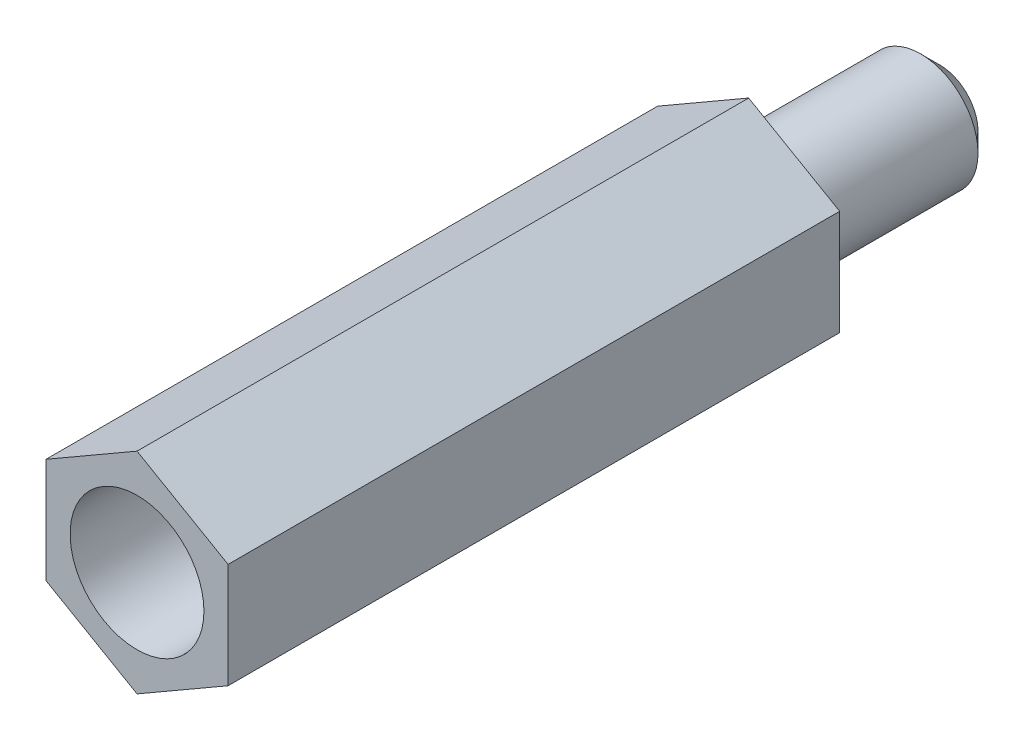
ISO-10303-21;
HEADER;
FILE_DESCRIPTION(('STEP AP214'),'2;1');
FILE_NAME('part.step','',(''),(''),'','','');
FILE_SCHEMA(('AUTOMOTIVE_DESIGN { 1 0 10303 214 1 1 1 1 }'));
ENDSEC;
DATA;
#1=APPLICATION_CONTEXT('core data for automotive mechanical design processes');
#2=APPLICATION_PROTOCOL_DEFINITION('international standard','automotive_design',2000,#1);
#3=PRODUCT_CONTEXT('',#1,'mechanical');
#4=PRODUCT('Part','Part','',(#3));
#5=PRODUCT_RELATED_PRODUCT_CATEGORY('part','',(#4));
#6=PRODUCT_DEFINITION_FORMATION('','',#4);
#7=PRODUCT_DEFINITION_CONTEXT('part definition',#1,'design');
#8=PRODUCT_DEFINITION('design','',#6,#7);
#9=PRODUCT_DEFINITION_SHAPE('','',#8);
#10=(LENGTH_UNIT() NAMED_UNIT(*) SI_UNIT(.MILLI.,.METRE.));
#11=(NAMED_UNIT(*) PLANE_ANGLE_UNIT() SI_UNIT($,.RADIAN.));
#12=(NAMED_UNIT(*) SI_UNIT($,.STERADIAN.) SOLID_ANGLE_UNIT());
#13=UNCERTAINTY_MEASURE_WITH_UNIT(LENGTH_MEASURE(1.E-05),#10,'distance_accuracy_value','');
#14=(GEOMETRIC_REPRESENTATION_CONTEXT(3) GLOBAL_UNCERTAINTY_ASSIGNED_CONTEXT((#13)) GLOBAL_UNIT_ASSIGNED_CONTEXT((#10,
#11,#12)) REPRESENTATION_CONTEXT('',''));
#15=CARTESIAN_POINT('',(0.,0.,0.));
#16=DIRECTION('',(0.,0.,1.));
#17=DIRECTION('',(1.,0.,0.));
#18=AXIS2_PLACEMENT_3D('',#15,#16,#17);
#19=CARTESIAN_POINT('',(0.,2.75,0.));
#20=DIRECTION('',(0.,0.,1.));
#21=DIRECTION('',(1.,0.,0.));
#22=AXIS2_PLACEMENT_3D('',#19,#20,#21);
#23=PLANE('',#22);
#24=DIRECTION('',(-0.866025403784442,0.499999999999995,0.));
#25=VECTOR('',#24,1.);
#26=CARTESIAN_POINT('',(2.38156986040719,1.37500000000003,0.));
#27=LINE('',#26,#25);
#28=CARTESIAN_POINT('',(2.38156986040719,1.37500000000003,0.));
#29=VERTEX_POINT('',#28);
#30=CARTESIAN_POINT('',(0.,2.75,0.));
#31=VERTEX_POINT('',#30);
#32=EDGE_CURVE('E116',#29,#31,#27,.T.);
#33=ORIENTED_EDGE('',*,*,#32,.F.);
#34=DIRECTION('',(0.,1.,0.));
#35=VECTOR('',#34,1.);
#36=CARTESIAN_POINT('',(2.38156986040722,-1.37499999999998,0.));
#37=LINE('',#36,#35);
#38=CARTESIAN_POINT('',(2.38156986040722,-1.37499999999998,0.));
#39=VERTEX_POINT('',#38);
#40=EDGE_CURVE('E76',#39,#29,#37,.T.);
#41=ORIENTED_EDGE('',*,*,#40,.F.);
#42=DIRECTION('',(0.866025403784434,0.500000000000007,0.));
#43=VECTOR('',#42,1.);
#44=CARTESIAN_POINT('',(0.,-2.75,0.));
#45=LINE('',#44,#43);
#46=CARTESIAN_POINT('',(0.,-2.75,0.));
#47=VERTEX_POINT('',#46);
#48=EDGE_CURVE('E70',#47,#39,#45,.T.);
#49=ORIENTED_EDGE('',*,*,#48,.F.);
#50=DIRECTION('',(0.866025403784441,-0.499999999999995,0.));
#51=VECTOR('',#50,1.);
#52=CARTESIAN_POINT('',(-2.3815698604072,-1.37500000000001,0.));
#53=LINE('',#52,#51);
#54=CARTESIAN_POINT('',(-2.3815698604072,-1.37500000000001,0.));
#55=VERTEX_POINT('',#54);
#56=EDGE_CURVE('E106',#55,#47,#53,.T.);
#57=ORIENTED_EDGE('',*,*,#56,.F.);
#58=DIRECTION('',(0.,-1.,0.));
#59=VECTOR('',#58,1.);
#60=CARTESIAN_POINT('',(-2.38156986040721,1.37499999999999,0.));
#61=LINE('',#60,#59);
#62=CARTESIAN_POINT('',(-2.38156986040721,1.37499999999999,0.));
#63=VERTEX_POINT('',#62);
#64=EDGE_CURVE('E122',#63,#55,#61,.T.);
#65=ORIENTED_EDGE('',*,*,#64,.F.);
#66=DIRECTION('',(-0.866025403784438,-0.500000000000001,0.));
#67=VECTOR('',#66,1.);
#68=CARTESIAN_POINT('',(0.,2.75,0.));
#69=LINE('',#68,#67);
#70=EDGE_CURVE('E119',#31,#63,#69,.T.);
#71=ORIENTED_EDGE('',*,*,#70,.F.);
#72=EDGE_LOOP('',(#33,#41,#49,#57,#65,#71));
#73=FACE_BOUND('',#72,.T.);
#74=CARTESIAN_POINT('',(0.,0.,0.));
#75=DIRECTION('',(0.,0.,1.));
#76=DIRECTION('',(1.,0.,0.));
#77=AXIS2_PLACEMENT_3D('',#74,#75,#76);
#78=CIRCLE('',#77,1.5);
#79=CARTESIAN_POINT('',(1.5,0.,0.));
#80=VERTEX_POINT('',#79);
#81=EDGE_CURVE('E136',#80,#80,#78,.F.);
#82=ORIENTED_EDGE('',*,*,#81,.F.);
#83=EDGE_LOOP('',(#82));
#84=FACE_BOUND('',#83,.T.);
#85=ADVANCED_FACE('F30',(#73,#84),#23,.F.);
#86=CARTESIAN_POINT('',(2.38156986040719,1.37500000000003,16.));
#87=DIRECTION('',(-0.499999999999995,-0.866025403784442,0.));
#88=DIRECTION('',(0.866025403784442,-0.499999999999995,0.));
#89=AXIS2_PLACEMENT_3D('',#86,#87,#88);
#90=PLANE('',#89);
#91=ORIENTED_EDGE('',*,*,#32,.T.);
#92=DIRECTION('',(0.,0.,-1.));
#93=VECTOR('',#92,1.);
#94=CARTESIAN_POINT('',(0.,2.75,16.));
#95=LINE('',#94,#93);
#96=CARTESIAN_POINT('',(0.,2.75,16.));
#97=VERTEX_POINT('',#96);
#98=EDGE_CURVE('E134',#97,#31,#95,.T.);
#99=ORIENTED_EDGE('',*,*,#98,.F.);
#100=DIRECTION('',(-0.866025403784442,0.499999999999995,0.));
#101=VECTOR('',#100,1.);
#102=CARTESIAN_POINT('',(2.38156986040719,1.37500000000003,16.));
#103=LINE('',#102,#101);
#104=CARTESIAN_POINT('',(2.38156986040719,1.37500000000003,16.));
#105=VERTEX_POINT('',#104);
#106=EDGE_CURVE('E127',#105,#97,#103,.T.);
#107=ORIENTED_EDGE('',*,*,#106,.F.);
#108=DIRECTION('',(0.,0.,-1.));
#109=VECTOR('',#108,1.);
#110=CARTESIAN_POINT('',(2.38156986040719,1.37500000000003,16.));
#111=LINE('',#110,#109);
#112=EDGE_CURVE('E112',#105,#29,#111,.T.);
#113=ORIENTED_EDGE('',*,*,#112,.T.);
#114=EDGE_LOOP('',(#91,#99,#107,#113));
#115=FACE_BOUND('',#114,.T.);
#116=ADVANCED_FACE('F153',(#115),#90,.F.);
#117=CARTESIAN_POINT('',(0.,2.75,16.));
#118=DIRECTION('',(0.500000000000001,-0.866025403784438,0.));
#119=DIRECTION('',(0.866025403784438,0.500000000000001,0.));
#120=AXIS2_PLACEMENT_3D('',#117,#118,#119);
#121=PLANE('',#120);
#122=ORIENTED_EDGE('',*,*,#70,.T.);
#123=DIRECTION('',(0.,0.,-1.));
#124=VECTOR('',#123,1.);
#125=CARTESIAN_POINT('',(-2.38156986040721,1.37499999999999,16.));
#126=LINE('',#125,#124);
#127=CARTESIAN_POINT('',(-2.38156986040721,1.37499999999999,16.));
#128=VERTEX_POINT('',#127);
#129=EDGE_CURVE('E131',#128,#63,#126,.T.);
#130=ORIENTED_EDGE('',*,*,#129,.F.);
#131=DIRECTION('',(-0.866025403784438,-0.500000000000001,0.));
#132=VECTOR('',#131,1.);
#133=CARTESIAN_POINT('',(0.,2.75,16.));
#134=LINE('',#133,#132);
#135=EDGE_CURVE('E85',#97,#128,#134,.T.);
#136=ORIENTED_EDGE('',*,*,#135,.F.);
#137=ORIENTED_EDGE('',*,*,#98,.T.);
#138=EDGE_LOOP('',(#122,#130,#136,#137));
#139=FACE_BOUND('',#138,.T.);
#140=ADVANCED_FACE('F159',(#139),#121,.F.);
#141=CARTESIAN_POINT('',(-2.38156986040721,1.37499999999999,16.));
#142=DIRECTION('',(1.,0.,0.));
#143=DIRECTION('',(0.,1.,0.));
#144=AXIS2_PLACEMENT_3D('',#141,#142,#143);
#145=PLANE('',#144);
#146=ORIENTED_EDGE('',*,*,#64,.T.);
#147=DIRECTION('',(0.,0.,-1.));
#148=VECTOR('',#147,1.);
#149=CARTESIAN_POINT('',(-2.3815698604072,-1.37500000000001,16.));
#150=LINE('',#149,#148);
#151=CARTESIAN_POINT('',(-2.3815698604072,-1.37500000000001,16.));
#152=VERTEX_POINT('',#151);
#153=EDGE_CURVE('E107',#152,#55,#150,.T.);
#154=ORIENTED_EDGE('',*,*,#153,.F.);
#155=DIRECTION('',(0.,-1.,0.));
#156=VECTOR('',#155,1.);
#157=CARTESIAN_POINT('',(-2.38156986040721,1.37499999999999,16.));
#158=LINE('',#157,#156);
#159=EDGE_CURVE('E98',#128,#152,#158,.T.);
#160=ORIENTED_EDGE('',*,*,#159,.F.);
#161=ORIENTED_EDGE('',*,*,#129,.T.);
#162=EDGE_LOOP('',(#146,#154,#160,#161));
#163=FACE_BOUND('',#162,.T.);
#164=ADVANCED_FACE('F173',(#163),#145,.F.);
#165=CARTESIAN_POINT('',(-2.3815698604072,-1.37500000000001,16.));
#166=DIRECTION('',(0.499999999999995,0.866025403784441,0.));
#167=DIRECTION('',(-0.866025403784442,0.499999999999995,0.));
#168=AXIS2_PLACEMENT_3D('',#165,#166,#167);
#169=PLANE('',#168);
#170=ORIENTED_EDGE('',*,*,#56,.T.);
#171=DIRECTION('',(0.,0.,-1.));
#172=VECTOR('',#171,1.);
#173=CARTESIAN_POINT('',(0.,-2.75,16.));
#174=LINE('',#173,#172);
#175=CARTESIAN_POINT('',(0.,-2.75,16.));
#176=VERTEX_POINT('',#175);
#177=EDGE_CURVE('E103',#176,#47,#174,.T.);
#178=ORIENTED_EDGE('',*,*,#177,.F.);
#179=DIRECTION('',(0.866025403784441,-0.499999999999995,0.));
#180=VECTOR('',#179,1.);
#181=CARTESIAN_POINT('',(-2.3815698604072,-1.37500000000001,16.));
#182=LINE('',#181,#180);
#183=EDGE_CURVE('E92',#152,#176,#182,.T.);
#184=ORIENTED_EDGE('',*,*,#183,.F.);
#185=ORIENTED_EDGE('',*,*,#153,.T.);
#186=EDGE_LOOP('',(#170,#178,#184,#185));
#187=FACE_BOUND('',#186,.T.);
#188=ADVANCED_FACE('F104',(#187),#169,.F.);
#189=CARTESIAN_POINT('',(0.,-2.75,16.));
#190=DIRECTION('',(-0.500000000000007,0.866025403784435,0.));
#191=DIRECTION('',(-0.866025403784434,-0.500000000000007,0.));
#192=AXIS2_PLACEMENT_3D('',#189,#190,#191);
#193=PLANE('',#192);
#194=ORIENTED_EDGE('',*,*,#48,.T.);
#195=DIRECTION('',(0.,0.,-1.));
#196=VECTOR('',#195,1.);
#197=CARTESIAN_POINT('',(2.38156986040722,-1.37499999999998,16.));
#198=LINE('',#197,#196);
#199=CARTESIAN_POINT('',(2.38156986040722,-1.37499999999998,16.));
#200=VERTEX_POINT('',#199);
#201=EDGE_CURVE('E108',#200,#39,#198,.T.);
#202=ORIENTED_EDGE('',*,*,#201,.F.);
#203=DIRECTION('',(0.866025403784434,0.500000000000007,0.));
#204=VECTOR('',#203,1.);
#205=CARTESIAN_POINT('',(0.,-2.75,16.));
#206=LINE('',#205,#204);
#207=EDGE_CURVE('E96',#176,#200,#206,.T.);
#208=ORIENTED_EDGE('',*,*,#207,.F.);
#209=ORIENTED_EDGE('',*,*,#177,.T.);
#210=EDGE_LOOP('',(#194,#202,#208,#209));
#211=FACE_BOUND('',#210,.T.);
#212=ADVANCED_FACE('F110',(#211),#193,.F.);
#213=CARTESIAN_POINT('',(2.38156986040722,-1.37499999999998,16.));
#214=DIRECTION('',(-1.,0.,0.));
#215=DIRECTION('',(0.,-1.,0.));
#216=AXIS2_PLACEMENT_3D('',#213,#214,#215);
#217=PLANE('',#216);
#218=ORIENTED_EDGE('',*,*,#40,.T.);
#219=ORIENTED_EDGE('',*,*,#112,.F.);
#220=DIRECTION('',(0.,1.,0.));
#221=VECTOR('',#220,1.);
#222=CARTESIAN_POINT('',(2.38156986040722,-1.37499999999998,16.));
#223=LINE('',#222,#221);
#224=EDGE_CURVE('E47',#200,#105,#223,.T.);
#225=ORIENTED_EDGE('',*,*,#224,.F.);
#226=ORIENTED_EDGE('',*,*,#201,.T.);
#227=EDGE_LOOP('',(#218,#219,#225,#226));
#228=FACE_BOUND('',#227,.T.);
#229=ADVANCED_FACE('F166',(#228),#217,.F.);
#230=CARTESIAN_POINT('',(0.,2.75,16.));
#231=DIRECTION('',(0.,0.,1.));
#232=DIRECTION('',(1.,0.,0.));
#233=AXIS2_PLACEMENT_3D('',#230,#231,#232);
#234=PLANE('',#233);
#235=CARTESIAN_POINT('',(0.,0.,16.));
#236=DIRECTION('',(0.,0.,1.));
#237=DIRECTION('',(1.,0.,0.));
#238=AXIS2_PLACEMENT_3D('',#235,#236,#237);
#239=CIRCLE('',#238,1.75);
#240=CARTESIAN_POINT('',(1.75,0.,16.));
#241=VERTEX_POINT('',#240);
#242=EDGE_CURVE('E186',#241,#241,#239,.T.);
#243=ORIENTED_EDGE('',*,*,#242,.F.);
#244=EDGE_LOOP('',(#243));
#245=FACE_BOUND('',#244,.T.);
#246=ORIENTED_EDGE('',*,*,#106,.T.);
#247=ORIENTED_EDGE('',*,*,#135,.T.);
#248=ORIENTED_EDGE('',*,*,#159,.T.);
#249=ORIENTED_EDGE('',*,*,#183,.T.);
#250=ORIENTED_EDGE('',*,*,#207,.T.);
#251=ORIENTED_EDGE('',*,*,#224,.T.);
#252=EDGE_LOOP('',(#246,#247,#248,#249,#250,#251));
#253=FACE_BOUND('',#252,.T.);
#254=ADVANCED_FACE('F94',(#245,#253),#234,.T.);
#255=CARTESIAN_POINT('',(0.,0.,8.));
#256=DIRECTION('',(0.,0.,1.));
#257=DIRECTION('',(1.,0.,0.));
#258=AXIS2_PLACEMENT_3D('',#255,#256,#257);
#259=CYLINDRICAL_SURFACE('',#258,1.75);
#260=CARTESIAN_POINT('',(0.,0.,8.));
#261=DIRECTION('',(0.,0.,1.));
#262=DIRECTION('',(1.,0.,0.));
#263=AXIS2_PLACEMENT_3D('',#260,#261,#262);
#264=CIRCLE('',#263,1.75);
#265=CARTESIAN_POINT('',(1.75,0.,8.));
#266=VERTEX_POINT('',#265);
#267=EDGE_CURVE('E120',#266,#266,#264,.T.);
#268=ORIENTED_EDGE('',*,*,#267,.F.);
#269=EDGE_LOOP('',(#268));
#270=FACE_BOUND('',#269,.T.);
#271=ORIENTED_EDGE('',*,*,#242,.T.);
#272=EDGE_LOOP('',(#271));
#273=FACE_BOUND('',#272,.T.);
#274=ADVANCED_FACE('F194',(#270,#273),#259,.F.);
#275=CARTESIAN_POINT('',(0.,0.,8.));
#276=DIRECTION('',(0.,0.,1.));
#277=DIRECTION('',(1.,0.,0.));
#278=AXIS2_PLACEMENT_3D('',#275,#276,#277);
#279=PLANE('',#278);
#280=ORIENTED_EDGE('',*,*,#267,.T.);
#281=EDGE_LOOP('',(#280));
#282=FACE_BOUND('',#281,.T.);
#283=ADVANCED_FACE('F192',(#282),#279,.T.);
#284=CARTESIAN_POINT('',(0.,0.,-5.));
#285=DIRECTION('',(0.,0.,1.));
#286=DIRECTION('',(1.,0.,0.));
#287=AXIS2_PLACEMENT_3D('',#284,#285,#286);
#288=CYLINDRICAL_SURFACE('',#287,1.5);
#289=CARTESIAN_POINT('',(0.,0.,-4.5));
#290=DIRECTION('',(0.,0.,-1.));
#291=DIRECTION('',(-1.,0.,0.));
#292=AXIS2_PLACEMENT_3D('',#289,#290,#291);
#293=CIRCLE('',#292,1.5);
#294=CARTESIAN_POINT('',(-1.5,0.,-4.5));
#295=VERTEX_POINT('',#294);
#296=EDGE_CURVE('E11',#295,#295,#293,.F.);
#297=ORIENTED_EDGE('',*,*,#296,.T.);
#298=EDGE_LOOP('',(#297));
#299=FACE_BOUND('',#298,.T.);
#300=ORIENTED_EDGE('',*,*,#81,.T.);
#301=EDGE_LOOP('',(#300));
#302=FACE_BOUND('',#301,.T.);
#303=ADVANCED_FACE('F149',(#299,#302),#288,.T.);
#304=CARTESIAN_POINT('',(0.,0.,-5.));
#305=DIRECTION('',(0.,0.,-1.));
#306=DIRECTION('',(-1.,0.,0.));
#307=AXIS2_PLACEMENT_3D('',#304,#305,#306);
#308=PLANE('',#307);
#309=CARTESIAN_POINT('',(0.,0.,-5.));
#310=DIRECTION('',(0.,0.,-1.));
#311=DIRECTION('',(-1.,0.,0.));
#312=AXIS2_PLACEMENT_3D('',#309,#310,#311);
#313=CIRCLE('',#312,0.999999999999997);
#314=CARTESIAN_POINT('',(-0.999999999999997,0.,-5.));
#315=VERTEX_POINT('',#314);
#316=EDGE_CURVE('E39',#315,#315,#313,.T.);
#317=ORIENTED_EDGE('',*,*,#316,.T.);
#318=EDGE_LOOP('',(#317));
#319=FACE_BOUND('',#318,.T.);
#320=ADVANCED_FACE('F141',(#319),#308,.T.);
#321=CARTESIAN_POINT('',(0.,0.,-5.));
#322=DIRECTION('',(0.,0.,1.));
#323=DIRECTION('',(1.,0.,0.));
#324=AXIS2_PLACEMENT_3D('',#321,#322,#323);
#325=CONICAL_SURFACE('',#324,0.999999999999997,0.785398163397446);
#326=ORIENTED_EDGE('',*,*,#296,.F.);
#327=EDGE_LOOP('',(#326));
#328=FACE_BOUND('',#327,.T.);
#329=ORIENTED_EDGE('',*,*,#316,.F.);
#330=EDGE_LOOP('',(#329));
#331=FACE_BOUND('',#330,.T.);
#332=ADVANCED_FACE('F32',(#328,#331),#325,.T.);
#333=CLOSED_SHELL('',(#85,#116,#140,#164,#188,#212,#229,#254,#274,#283,#303,#320,#332));
#334=MANIFOLD_SOLID_BREP('B2',#333);
#335=ADVANCED_BREP_SHAPE_REPRESENTATION('',(#18,#334),#14);
#336=SHAPE_DEFINITION_REPRESENTATION(#9,#335);
ENDSEC;
END-ISO-10303-21;
